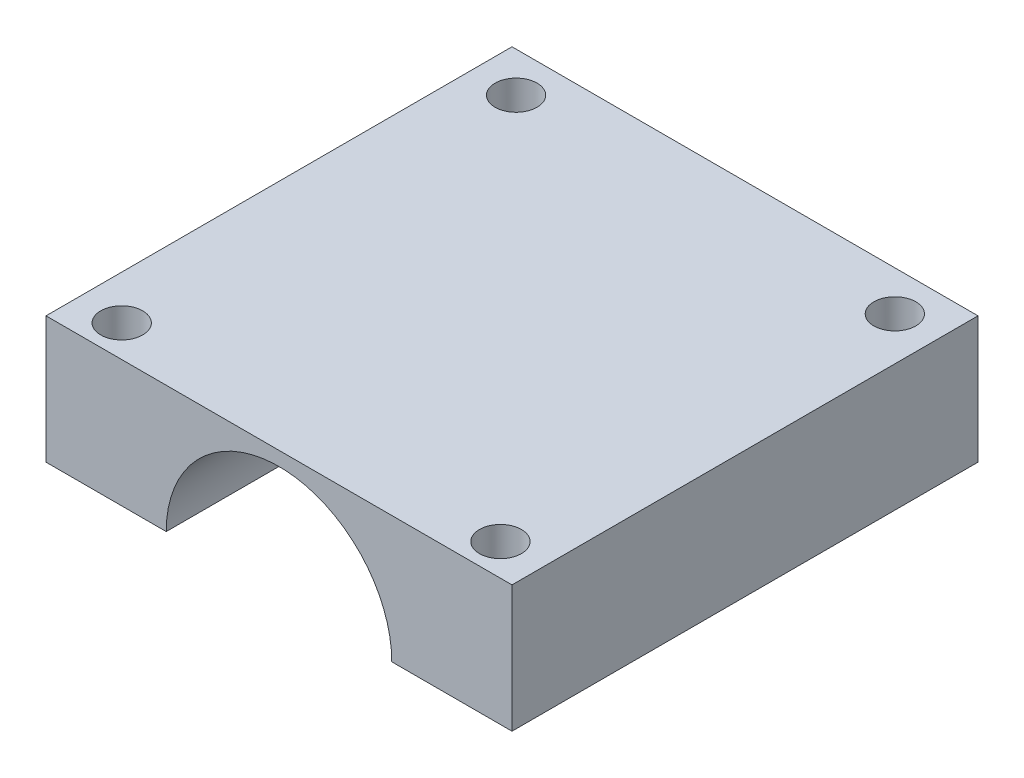
ISO-10303-21;
HEADER;
FILE_DESCRIPTION(('STEP AP214'),'2;1');
FILE_NAME('part.step','',(''),(''),'','','');
FILE_SCHEMA(('AUTOMOTIVE_DESIGN { 1 0 10303 214 1 1 1 1 }'));
ENDSEC;
DATA;
#1=APPLICATION_CONTEXT('core data for automotive mechanical design processes');
#2=APPLICATION_PROTOCOL_DEFINITION('international standard','automotive_design',2000,#1);
#3=PRODUCT_CONTEXT('',#1,'mechanical');
#4=PRODUCT('Part','Part','',(#3));
#5=PRODUCT_RELATED_PRODUCT_CATEGORY('part','',(#4));
#6=PRODUCT_DEFINITION_FORMATION('','',#4);
#7=PRODUCT_DEFINITION_CONTEXT('part definition',#1,'design');
#8=PRODUCT_DEFINITION('design','',#6,#7);
#9=PRODUCT_DEFINITION_SHAPE('','',#8);
#10=(LENGTH_UNIT() NAMED_UNIT(*) SI_UNIT(.MILLI.,.METRE.));
#11=(NAMED_UNIT(*) PLANE_ANGLE_UNIT() SI_UNIT($,.RADIAN.));
#12=(NAMED_UNIT(*) SI_UNIT($,.STERADIAN.) SOLID_ANGLE_UNIT());
#13=UNCERTAINTY_MEASURE_WITH_UNIT(LENGTH_MEASURE(1.E-05),#10,'distance_accuracy_value','');
#14=(GEOMETRIC_REPRESENTATION_CONTEXT(3) GLOBAL_UNCERTAINTY_ASSIGNED_CONTEXT((#13)) GLOBAL_UNIT_ASSIGNED_CONTEXT((#10,
#11,#12)) REPRESENTATION_CONTEXT('',''));
#15=CARTESIAN_POINT('',(0.,0.,0.));
#16=DIRECTION('',(0.,0.,1.));
#17=DIRECTION('',(1.,0.,0.));
#18=AXIS2_PLACEMENT_3D('',#15,#16,#17);
#19=CARTESIAN_POINT('',(0.,0.,0.));
#20=DIRECTION('',(0.,1.,0.));
#21=DIRECTION('',(-1.,0.,0.));
#22=AXIS2_PLACEMENT_3D('',#19,#20,#21);
#23=PLANE('',#22);
#24=DIRECTION('',(-1.,0.,0.));
#25=VECTOR('',#24,1.);
#26=CARTESIAN_POINT('',(0.,0.,50.));
#27=LINE('',#26,#25);
#28=CARTESIAN_POINT('',(-12.1,0.,50.));
#29=VERTEX_POINT('',#28);
#30=CARTESIAN_POINT('',(-25.,0.,50.));
#31=VERTEX_POINT('',#30);
#32=EDGE_CURVE('E48',#29,#31,#27,.T.);
#33=ORIENTED_EDGE('',*,*,#32,.T.);
#34=DIRECTION('',(0.,0.,-1.));
#35=VECTOR('',#34,1.);
#36=CARTESIAN_POINT('',(-25.,0.,50.));
#37=LINE('',#36,#35);
#38=CARTESIAN_POINT('',(-25.,0.,0.));
#39=VERTEX_POINT('',#38);
#40=EDGE_CURVE('E11',#31,#39,#37,.T.);
#41=ORIENTED_EDGE('',*,*,#40,.T.);
#42=DIRECTION('',(-1.,0.,0.));
#43=VECTOR('',#42,1.);
#44=CARTESIAN_POINT('',(0.,0.,0.));
#45=LINE('',#44,#43);
#46=CARTESIAN_POINT('',(-12.1,0.,0.));
#47=VERTEX_POINT('',#46);
#48=EDGE_CURVE('E56',#47,#39,#45,.T.);
#49=ORIENTED_EDGE('',*,*,#48,.F.);
#50=DIRECTION('',(0.,0.,-1.));
#51=VECTOR('',#50,1.);
#52=CARTESIAN_POINT('',(-12.1,0.,50.));
#53=LINE('',#52,#51);
#54=EDGE_CURVE('E147',#47,#29,#53,.F.);
#55=ORIENTED_EDGE('',*,*,#54,.T.);
#56=EDGE_LOOP('',(#33,#41,#49,#55));
#57=FACE_BOUND('',#56,.T.);
#58=CARTESIAN_POINT('',(-20.282339383463,0.,46.5955843795144));
#59=DIRECTION('',(0.,1.,0.));
#60=DIRECTION('',(-1.,0.,0.));
#61=AXIS2_PLACEMENT_3D('',#58,#59,#60);
#62=CIRCLE('',#61,2.25);
#63=CARTESIAN_POINT('',(-22.532339383463,0.,46.5955843795144));
#64=VERTEX_POINT('',#63);
#65=EDGE_CURVE('E139',#64,#64,#62,.F.);
#66=ORIENTED_EDGE('',*,*,#65,.F.);
#67=EDGE_LOOP('',(#66));
#68=FACE_BOUND('',#67,.T.);
#69=CARTESIAN_POINT('',(-20.282339383463,0.,4.27991228451974));
#70=DIRECTION('',(0.,1.,0.));
#71=DIRECTION('',(-1.,0.,0.));
#72=AXIS2_PLACEMENT_3D('',#69,#70,#71);
#73=CIRCLE('',#72,2.25);
#74=CARTESIAN_POINT('',(-22.532339383463,0.,4.27991228451974));
#75=VERTEX_POINT('',#74);
#76=EDGE_CURVE('E136',#75,#75,#73,.F.);
#77=ORIENTED_EDGE('',*,*,#76,.F.);
#78=EDGE_LOOP('',(#77));
#79=FACE_BOUND('',#78,.T.);
#80=ADVANCED_FACE('F39',(#57,#68,#79),#23,.F.);
#81=CARTESIAN_POINT('',(25.,0.,50.));
#82=VERTEX_POINT('',#81);
#83=CARTESIAN_POINT('',(12.1,0.,50.));
#84=VERTEX_POINT('',#83);
#85=EDGE_CURVE('E148',#82,#84,#27,.T.);
#86=ORIENTED_EDGE('',*,*,#85,.T.);
#87=DIRECTION('',(0.,0.,-1.));
#88=VECTOR('',#87,1.);
#89=CARTESIAN_POINT('',(12.1,0.,50.));
#90=LINE('',#89,#88);
#91=CARTESIAN_POINT('',(12.1,0.,0.));
#92=VERTEX_POINT('',#91);
#93=EDGE_CURVE('E43',#84,#92,#90,.T.);
#94=ORIENTED_EDGE('',*,*,#93,.T.);
#95=CARTESIAN_POINT('',(25.,0.,0.));
#96=VERTEX_POINT('',#95);
#97=EDGE_CURVE('E145',#96,#92,#45,.T.);
#98=ORIENTED_EDGE('',*,*,#97,.F.);
#99=DIRECTION('',(0.,0.,-1.));
#100=VECTOR('',#99,1.);
#101=CARTESIAN_POINT('',(25.,0.,50.));
#102=LINE('',#101,#100);
#103=EDGE_CURVE('E103',#82,#96,#102,.T.);
#104=ORIENTED_EDGE('',*,*,#103,.F.);
#105=EDGE_LOOP('',(#86,#94,#98,#104));
#106=FACE_BOUND('',#105,.T.);
#107=CARTESIAN_POINT('',(20.3552974387992,0.,46.5955843795144));
#108=DIRECTION('',(0.,1.,0.));
#109=DIRECTION('',(-1.,0.,0.));
#110=AXIS2_PLACEMENT_3D('',#107,#108,#109);
#111=CIRCLE('',#110,2.25);
#112=CARTESIAN_POINT('',(18.1052974387992,0.,46.5955843795144));
#113=VERTEX_POINT('',#112);
#114=EDGE_CURVE('E142',#113,#113,#111,.F.);
#115=ORIENTED_EDGE('',*,*,#114,.F.);
#116=EDGE_LOOP('',(#115));
#117=FACE_BOUND('',#116,.T.);
#118=CARTESIAN_POINT('',(20.3552974387992,0.,4.27991228451974));
#119=DIRECTION('',(0.,1.,0.));
#120=DIRECTION('',(-1.,0.,0.));
#121=AXIS2_PLACEMENT_3D('',#118,#119,#120);
#122=CIRCLE('',#121,2.25);
#123=CARTESIAN_POINT('',(18.1052974387992,0.,4.27991228451974));
#124=VERTEX_POINT('',#123);
#125=EDGE_CURVE('E102',#124,#124,#122,.F.);
#126=ORIENTED_EDGE('',*,*,#125,.F.);
#127=EDGE_LOOP('',(#126));
#128=FACE_BOUND('',#127,.T.);
#129=ADVANCED_FACE('F41',(#106,#117,#128),#23,.F.);
#130=CARTESIAN_POINT('',(0.,13.6,50.));
#131=DIRECTION('',(0.,1.,0.));
#132=DIRECTION('',(0.,0.,1.));
#133=AXIS2_PLACEMENT_3D('',#130,#131,#132);
#134=PLANE('',#133);
#135=CARTESIAN_POINT('',(20.3552974387992,13.6,4.27991228451974));
#136=DIRECTION('',(0.,-1.,0.));
#137=DIRECTION('',(0.,0.,-1.));
#138=AXIS2_PLACEMENT_3D('',#135,#136,#137);
#139=CIRCLE('',#138,2.25);
#140=CARTESIAN_POINT('',(20.3552974387992,13.6,2.02991228451974));
#141=VERTEX_POINT('',#140);
#142=EDGE_CURVE('E192',#141,#141,#139,.T.);
#143=ORIENTED_EDGE('',*,*,#142,.T.);
#144=EDGE_LOOP('',(#143));
#145=FACE_BOUND('',#144,.T.);
#146=CARTESIAN_POINT('',(-20.282339383463,13.6,4.27991228451974));
#147=DIRECTION('',(0.,-1.,0.));
#148=DIRECTION('',(0.,0.,-1.));
#149=AXIS2_PLACEMENT_3D('',#146,#147,#148);
#150=CIRCLE('',#149,2.25);
#151=CARTESIAN_POINT('',(-20.282339383463,13.6,2.02991228451974));
#152=VERTEX_POINT('',#151);
#153=EDGE_CURVE('E189',#152,#152,#150,.T.);
#154=ORIENTED_EDGE('',*,*,#153,.T.);
#155=EDGE_LOOP('',(#154));
#156=FACE_BOUND('',#155,.T.);
#157=CARTESIAN_POINT('',(-20.282339383463,13.6,46.5955843795144));
#158=DIRECTION('',(0.,-1.,0.));
#159=DIRECTION('',(0.,0.,-1.));
#160=AXIS2_PLACEMENT_3D('',#157,#158,#159);
#161=CIRCLE('',#160,2.25);
#162=CARTESIAN_POINT('',(-20.282339383463,13.6,44.3455843795145));
#163=VERTEX_POINT('',#162);
#164=EDGE_CURVE('E191',#163,#163,#161,.T.);
#165=ORIENTED_EDGE('',*,*,#164,.T.);
#166=EDGE_LOOP('',(#165));
#167=FACE_BOUND('',#166,.T.);
#168=CARTESIAN_POINT('',(20.3552974387992,13.6,46.5955843795144));
#169=DIRECTION('',(0.,-1.,0.));
#170=DIRECTION('',(0.,0.,-1.));
#171=AXIS2_PLACEMENT_3D('',#168,#169,#170);
#172=CIRCLE('',#171,2.25);
#173=CARTESIAN_POINT('',(20.3552974387992,13.6,44.3455843795145));
#174=VERTEX_POINT('',#173);
#175=EDGE_CURVE('E126',#174,#174,#172,.T.);
#176=ORIENTED_EDGE('',*,*,#175,.T.);
#177=EDGE_LOOP('',(#176));
#178=FACE_BOUND('',#177,.T.);
#179=DIRECTION('',(1.,0.,0.));
#180=VECTOR('',#179,1.);
#181=CARTESIAN_POINT('',(0.,13.6,0.));
#182=LINE('',#181,#180);
#183=CARTESIAN_POINT('',(-25.,13.6,0.));
#184=VERTEX_POINT('',#183);
#185=CARTESIAN_POINT('',(25.,13.6,0.));
#186=VERTEX_POINT('',#185);
#187=EDGE_CURVE('E101',#184,#186,#182,.T.);
#188=ORIENTED_EDGE('',*,*,#187,.F.);
#189=DIRECTION('',(0.,0.,-1.));
#190=VECTOR('',#189,1.);
#191=CARTESIAN_POINT('',(-25.,13.6,50.));
#192=LINE('',#191,#190);
#193=CARTESIAN_POINT('',(-25.,13.6,50.));
#194=VERTEX_POINT('',#193);
#195=EDGE_CURVE('E95',#194,#184,#192,.T.);
#196=ORIENTED_EDGE('',*,*,#195,.F.);
#197=DIRECTION('',(1.,0.,0.));
#198=VECTOR('',#197,1.);
#199=CARTESIAN_POINT('',(0.,13.6,50.));
#200=LINE('',#199,#198);
#201=CARTESIAN_POINT('',(25.,13.6,50.));
#202=VERTEX_POINT('',#201);
#203=EDGE_CURVE('E98',#194,#202,#200,.T.);
#204=ORIENTED_EDGE('',*,*,#203,.T.);
#205=DIRECTION('',(0.,0.,-1.));
#206=VECTOR('',#205,1.);
#207=CARTESIAN_POINT('',(25.,13.6,50.));
#208=LINE('',#207,#206);
#209=EDGE_CURVE('E123',#202,#186,#208,.T.);
#210=ORIENTED_EDGE('',*,*,#209,.T.);
#211=EDGE_LOOP('',(#188,#196,#204,#210));
#212=FACE_BOUND('',#211,.T.);
#213=ADVANCED_FACE('F97',(#145,#156,#167,#178,#212),#134,.T.);
#214=CARTESIAN_POINT('',(20.3552974387992,-13.6,4.27991228451974));
#215=DIRECTION('',(0.,-1.,0.));
#216=DIRECTION('',(0.,0.,-1.));
#217=AXIS2_PLACEMENT_3D('',#214,#215,#216);
#218=CYLINDRICAL_SURFACE('',#217,2.25);
#219=ORIENTED_EDGE('',*,*,#125,.T.);
#220=EDGE_LOOP('',(#219));
#221=FACE_BOUND('',#220,.T.);
#222=ORIENTED_EDGE('',*,*,#142,.F.);
#223=EDGE_LOOP('',(#222));
#224=FACE_BOUND('',#223,.T.);
#225=ADVANCED_FACE('F185',(#221,#224),#218,.F.);
#226=CARTESIAN_POINT('',(-20.282339383463,-13.6,4.27991228451974));
#227=DIRECTION('',(0.,-1.,0.));
#228=DIRECTION('',(0.,0.,-1.));
#229=AXIS2_PLACEMENT_3D('',#226,#227,#228);
#230=CYLINDRICAL_SURFACE('',#229,2.25);
#231=ORIENTED_EDGE('',*,*,#76,.T.);
#232=EDGE_LOOP('',(#231));
#233=FACE_BOUND('',#232,.T.);
#234=ORIENTED_EDGE('',*,*,#153,.F.);
#235=EDGE_LOOP('',(#234));
#236=FACE_BOUND('',#235,.T.);
#237=ADVANCED_FACE('F181',(#233,#236),#230,.F.);
#238=CARTESIAN_POINT('',(-20.282339383463,-13.6,46.5955843795144));
#239=DIRECTION('',(0.,-1.,0.));
#240=DIRECTION('',(0.,0.,-1.));
#241=AXIS2_PLACEMENT_3D('',#238,#239,#240);
#242=CYLINDRICAL_SURFACE('',#241,2.25);
#243=ORIENTED_EDGE('',*,*,#65,.T.);
#244=EDGE_LOOP('',(#243));
#245=FACE_BOUND('',#244,.T.);
#246=ORIENTED_EDGE('',*,*,#164,.F.);
#247=EDGE_LOOP('',(#246));
#248=FACE_BOUND('',#247,.T.);
#249=ADVANCED_FACE('F184',(#245,#248),#242,.F.);
#250=CARTESIAN_POINT('',(20.3552974387992,-13.6,46.5955843795144));
#251=DIRECTION('',(0.,-1.,0.));
#252=DIRECTION('',(0.,0.,-1.));
#253=AXIS2_PLACEMENT_3D('',#250,#251,#252);
#254=CYLINDRICAL_SURFACE('',#253,2.25);
#255=ORIENTED_EDGE('',*,*,#114,.T.);
#256=EDGE_LOOP('',(#255));
#257=FACE_BOUND('',#256,.T.);
#258=ORIENTED_EDGE('',*,*,#175,.F.);
#259=EDGE_LOOP('',(#258));
#260=FACE_BOUND('',#259,.T.);
#261=ADVANCED_FACE('F202',(#257,#260),#254,.F.);
#262=CARTESIAN_POINT('',(-25.,0.,50.));
#263=DIRECTION('',(-1.,0.,0.));
#264=DIRECTION('',(0.,0.,1.));
#265=AXIS2_PLACEMENT_3D('',#262,#263,#264);
#266=PLANE('',#265);
#267=DIRECTION('',(0.,1.,0.));
#268=VECTOR('',#267,1.);
#269=CARTESIAN_POINT('',(-25.,0.,0.));
#270=LINE('',#269,#268);
#271=EDGE_CURVE('E125',#39,#184,#270,.T.);
#272=ORIENTED_EDGE('',*,*,#271,.F.);
#273=ORIENTED_EDGE('',*,*,#40,.F.);
#274=DIRECTION('',(0.,1.,0.));
#275=VECTOR('',#274,1.);
#276=CARTESIAN_POINT('',(-25.,0.,50.));
#277=LINE('',#276,#275);
#278=EDGE_CURVE('E110',#31,#194,#277,.T.);
#279=ORIENTED_EDGE('',*,*,#278,.T.);
#280=ORIENTED_EDGE('',*,*,#195,.T.);
#281=EDGE_LOOP('',(#272,#273,#279,#280));
#282=FACE_BOUND('',#281,.T.);
#283=ADVANCED_FACE('F115',(#282),#266,.T.);
#284=CARTESIAN_POINT('',(0.,0.,50.));
#285=DIRECTION('',(0.,0.,-1.));
#286=DIRECTION('',(-1.,0.,0.));
#287=AXIS2_PLACEMENT_3D('',#284,#285,#286);
#288=CYLINDRICAL_SURFACE('',#287,12.1);
#289=ORIENTED_EDGE('',*,*,#93,.F.);
#290=CARTESIAN_POINT('',(0.,0.,50.));
#291=DIRECTION('',(0.,0.,1.));
#292=DIRECTION('',(1.,0.,0.));
#293=AXIS2_PLACEMENT_3D('',#290,#291,#292);
#294=CIRCLE('',#293,12.1);
#295=EDGE_CURVE('E117',#84,#29,#294,.T.);
#296=ORIENTED_EDGE('',*,*,#295,.T.);
#297=ORIENTED_EDGE('',*,*,#54,.F.);
#298=CARTESIAN_POINT('',(0.,0.,0.));
#299=DIRECTION('',(0.,0.,1.));
#300=DIRECTION('',(1.,0.,0.));
#301=AXIS2_PLACEMENT_3D('',#298,#299,#300);
#302=CIRCLE('',#301,12.1);
#303=EDGE_CURVE('E113',#92,#47,#302,.T.);
#304=ORIENTED_EDGE('',*,*,#303,.F.);
#305=EDGE_LOOP('',(#289,#296,#297,#304));
#306=FACE_BOUND('',#305,.T.);
#307=ADVANCED_FACE('F158',(#306),#288,.F.);
#308=CARTESIAN_POINT('',(25.,0.,50.));
#309=DIRECTION('',(1.,0.,0.));
#310=DIRECTION('',(0.,0.,-1.));
#311=AXIS2_PLACEMENT_3D('',#308,#309,#310);
#312=PLANE('',#311);
#313=DIRECTION('',(0.,-1.,0.));
#314=VECTOR('',#313,1.);
#315=CARTESIAN_POINT('',(25.,0.,0.));
#316=LINE('',#315,#314);
#317=EDGE_CURVE('E128',#186,#96,#316,.T.);
#318=ORIENTED_EDGE('',*,*,#317,.F.);
#319=ORIENTED_EDGE('',*,*,#209,.F.);
#320=DIRECTION('',(0.,-1.,0.));
#321=VECTOR('',#320,1.);
#322=CARTESIAN_POINT('',(25.,0.,50.));
#323=LINE('',#322,#321);
#324=EDGE_CURVE('E112',#202,#82,#323,.T.);
#325=ORIENTED_EDGE('',*,*,#324,.T.);
#326=ORIENTED_EDGE('',*,*,#103,.T.);
#327=EDGE_LOOP('',(#318,#319,#325,#326));
#328=FACE_BOUND('',#327,.T.);
#329=ADVANCED_FACE('F162',(#328),#312,.T.);
#330=CARTESIAN_POINT('',(0.,0.,0.));
#331=DIRECTION('',(0.,0.,1.));
#332=DIRECTION('',(1.,0.,0.));
#333=AXIS2_PLACEMENT_3D('',#330,#331,#332);
#334=PLANE('',#333);
#335=ORIENTED_EDGE('',*,*,#317,.T.);
#336=ORIENTED_EDGE('',*,*,#97,.T.);
#337=ORIENTED_EDGE('',*,*,#303,.T.);
#338=ORIENTED_EDGE('',*,*,#48,.T.);
#339=ORIENTED_EDGE('',*,*,#271,.T.);
#340=ORIENTED_EDGE('',*,*,#187,.T.);
#341=EDGE_LOOP('',(#335,#336,#337,#338,#339,#340));
#342=FACE_BOUND('',#341,.T.);
#343=ADVANCED_FACE('F159',(#342),#334,.F.);
#344=CARTESIAN_POINT('',(0.,0.,50.));
#345=DIRECTION('',(0.,0.,1.));
#346=DIRECTION('',(1.,0.,0.));
#347=AXIS2_PLACEMENT_3D('',#344,#345,#346);
#348=PLANE('',#347);
#349=ORIENTED_EDGE('',*,*,#85,.F.);
#350=ORIENTED_EDGE('',*,*,#324,.F.);
#351=ORIENTED_EDGE('',*,*,#203,.F.);
#352=ORIENTED_EDGE('',*,*,#278,.F.);
#353=ORIENTED_EDGE('',*,*,#32,.F.);
#354=ORIENTED_EDGE('',*,*,#295,.F.);
#355=EDGE_LOOP('',(#349,#350,#351,#352,#353,#354));
#356=FACE_BOUND('',#355,.T.);
#357=ADVANCED_FACE('F108',(#356),#348,.T.);
#358=CLOSED_SHELL('',(#80,#129,#213,#225,#237,#249,#261,#283,#307,#329,#343,#357));
#359=MANIFOLD_SOLID_BREP('B2',#358);
#360=ADVANCED_BREP_SHAPE_REPRESENTATION('',(#18,#359),#14);
#361=SHAPE_DEFINITION_REPRESENTATION(#9,#360);
ENDSEC;
END-ISO-10303-21;
